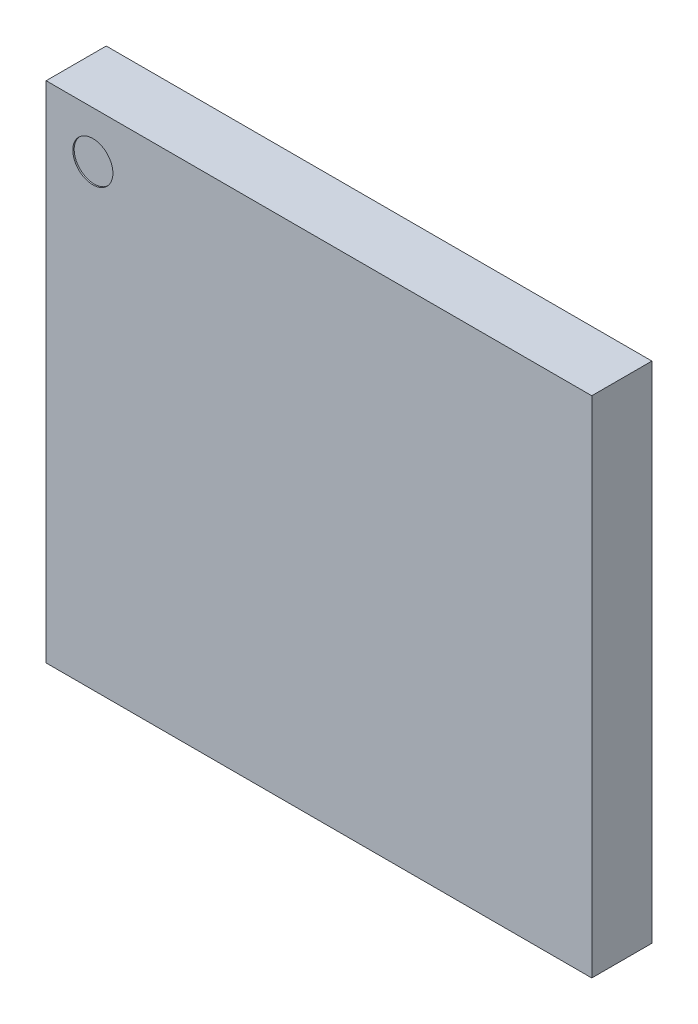
ISO-10303-21;
HEADER;
FILE_DESCRIPTION(('STEP AP214'),'2;1');
FILE_NAME('part.step','',(''),(''),'','','');
FILE_SCHEMA(('AUTOMOTIVE_DESIGN { 1 0 10303 214 1 1 1 1 }'));
ENDSEC;
DATA;
#1=APPLICATION_CONTEXT('core data for automotive mechanical design processes');
#2=APPLICATION_PROTOCOL_DEFINITION('international standard','automotive_design',2000,#1);
#3=PRODUCT_CONTEXT('',#1,'mechanical');
#4=PRODUCT('Part','Part','',(#3));
#5=PRODUCT_RELATED_PRODUCT_CATEGORY('part','',(#4));
#6=PRODUCT_DEFINITION_FORMATION('','',#4);
#7=PRODUCT_DEFINITION_CONTEXT('part definition',#1,'design');
#8=PRODUCT_DEFINITION('design','',#6,#7);
#9=PRODUCT_DEFINITION_SHAPE('','',#8);
#10=(LENGTH_UNIT() NAMED_UNIT(*) SI_UNIT(.MILLI.,.METRE.));
#11=(NAMED_UNIT(*) PLANE_ANGLE_UNIT() SI_UNIT($,.RADIAN.));
#12=(NAMED_UNIT(*) SI_UNIT($,.STERADIAN.) SOLID_ANGLE_UNIT());
#13=UNCERTAINTY_MEASURE_WITH_UNIT(LENGTH_MEASURE(1.E-05),#10,'distance_accuracy_value','');
#14=(GEOMETRIC_REPRESENTATION_CONTEXT(3) GLOBAL_UNCERTAINTY_ASSIGNED_CONTEXT((#13)) GLOBAL_UNIT_ASSIGNED_CONTEXT((#10,
#11,#12)) REPRESENTATION_CONTEXT('',''));
#15=CARTESIAN_POINT('',(0.,0.,0.));
#16=DIRECTION('',(0.,0.,1.));
#17=DIRECTION('',(1.,0.,0.));
#18=AXIS2_PLACEMENT_3D('',#15,#16,#17);
#19=CARTESIAN_POINT('',(0.,-1.88750000000007,0.582499999999956));
#20=DIRECTION('',(0.,0.,1.));
#21=DIRECTION('',(1.,0.,0.));
#22=AXIS2_PLACEMENT_3D('',#19,#20,#21);
#23=PLANE('',#22);
#24=CARTESIAN_POINT('',(-1.69250000000009,1.53749999999995,0.582499999999956));
#25=DIRECTION('',(0.,0.,1.));
#26=DIRECTION('',(1.,0.,0.));
#27=AXIS2_PLACEMENT_3D('',#24,#25,#26);
#28=CIRCLE('',#27,0.15000000000001);
#29=CARTESIAN_POINT('',(-1.54250000000008,1.53749999999995,0.582499999999956));
#30=VERTEX_POINT('',#29);
#31=EDGE_CURVE('E20',#30,#30,#28,.T.);
#32=ORIENTED_EDGE('',*,*,#31,.T.);
#33=EDGE_LOOP('',(#32));
#34=FACE_BOUND('',#33,.T.);
#35=ADVANCED_FACE('F17',(#34),#23,.T.);
#36=CARTESIAN_POINT('',(-1.69250000000009,1.53749999999995,0.592499999999916));
#37=DIRECTION('',(0.,0.,1.));
#38=DIRECTION('',(1.,0.,0.));
#39=AXIS2_PLACEMENT_3D('',#36,#37,#38);
#40=CYLINDRICAL_SURFACE('',#39,0.15000000000001);
#41=ORIENTED_EDGE('',*,*,#31,.F.);
#42=EDGE_LOOP('',(#41));
#43=FACE_BOUND('',#42,.T.);
#44=CARTESIAN_POINT('',(-1.69250000000009,1.53749999999995,0.592499999999916));
#45=DIRECTION('',(0.,0.,1.));
#46=DIRECTION('',(1.,0.,0.));
#47=AXIS2_PLACEMENT_3D('',#44,#45,#46);
#48=CIRCLE('',#47,0.15000000000001);
#49=CARTESIAN_POINT('',(-1.54250000000008,1.53749999999995,0.592499999999916));
#50=VERTEX_POINT('',#49);
#51=EDGE_CURVE('E69',#50,#50,#48,.F.);
#52=ORIENTED_EDGE('',*,*,#51,.F.);
#53=EDGE_LOOP('',(#52));
#54=FACE_BOUND('',#53,.T.);
#55=ADVANCED_FACE('F89',(#43,#54),#40,.F.);
#56=CARTESIAN_POINT('',(-2.04249999999996,-1.88750000000007,0.592499999999916));
#57=DIRECTION('',(0.,0.,1.));
#58=DIRECTION('',(1.,0.,0.));
#59=AXIS2_PLACEMENT_3D('',#56,#57,#58);
#60=PLANE('',#59);
#61=ORIENTED_EDGE('',*,*,#51,.T.);
#62=EDGE_LOOP('',(#61));
#63=FACE_BOUND('',#62,.T.);
#64=DIRECTION('',(0.,1.,0.));
#65=VECTOR('',#64,1.);
#66=CARTESIAN_POINT('',(-2.04249999999996,-1.88750000000007,0.592499999999916));
#67=LINE('',#66,#65);
#68=CARTESIAN_POINT('',(-2.04249999999996,-1.88750000000007,0.592499999999916));
#69=VERTEX_POINT('',#68);
#70=CARTESIAN_POINT('',(-2.04249999999996,1.88750000000007,0.592499999999916));
#71=VERTEX_POINT('',#70);
#72=EDGE_CURVE('E60',#69,#71,#67,.T.);
#73=ORIENTED_EDGE('',*,*,#72,.F.);
#74=DIRECTION('',(1.,0.,0.));
#75=VECTOR('',#74,1.);
#76=CARTESIAN_POINT('',(0.,-1.88750000000007,0.592499999999916));
#77=LINE('',#76,#75);
#78=CARTESIAN_POINT('',(2.04249999999996,-1.88750000000007,0.592499999999916));
#79=VERTEX_POINT('',#78);
#80=EDGE_CURVE('E197',#69,#79,#77,.T.);
#81=ORIENTED_EDGE('',*,*,#80,.T.);
#82=DIRECTION('',(0.,1.,0.));
#83=VECTOR('',#82,1.);
#84=CARTESIAN_POINT('',(2.04249999999996,-1.88750000000007,0.592499999999916));
#85=LINE('',#84,#83);
#86=CARTESIAN_POINT('',(2.04249999999996,1.88750000000007,0.592499999999916));
#87=VERTEX_POINT('',#86);
#88=EDGE_CURVE('E72',#87,#79,#85,.F.);
#89=ORIENTED_EDGE('',*,*,#88,.F.);
#90=DIRECTION('',(1.,0.,0.));
#91=VECTOR('',#90,1.);
#92=CARTESIAN_POINT('',(0.,1.88750000000007,0.592499999999916));
#93=LINE('',#92,#91);
#94=EDGE_CURVE('E55',#71,#87,#93,.T.);
#95=ORIENTED_EDGE('',*,*,#94,.F.);
#96=EDGE_LOOP('',(#73,#81,#89,#95));
#97=FACE_BOUND('',#96,.T.);
#98=ADVANCED_FACE('F71',(#63,#97),#60,.T.);
#99=CARTESIAN_POINT('',(-2.04249999999996,-1.88750000000007,0.142499999999989));
#100=DIRECTION('',(-1.,0.,0.));
#101=DIRECTION('',(0.,0.,1.));
#102=AXIS2_PLACEMENT_3D('',#99,#100,#101);
#103=PLANE('',#102);
#104=DIRECTION('',(0.,1.,0.));
#105=VECTOR('',#104,1.);
#106=CARTESIAN_POINT('',(-2.04249999999996,-1.88750000000007,0.142499999999989));
#107=LINE('',#106,#105);
#108=CARTESIAN_POINT('',(-2.04249999999996,-1.88750000000007,0.142499999999989));
#109=VERTEX_POINT('',#108);
#110=CARTESIAN_POINT('',(-2.04249999999996,1.88750000000007,0.142499999999989));
#111=VERTEX_POINT('',#110);
#112=EDGE_CURVE('E198',#109,#111,#107,.T.);
#113=ORIENTED_EDGE('',*,*,#112,.F.);
#114=DIRECTION('',(0.,0.,1.));
#115=VECTOR('',#114,1.);
#116=CARTESIAN_POINT('',(-2.04249999999996,-1.88750000000007,0.));
#117=LINE('',#116,#115);
#118=EDGE_CURVE('E65',#109,#69,#117,.T.);
#119=ORIENTED_EDGE('',*,*,#118,.T.);
#120=ORIENTED_EDGE('',*,*,#72,.T.);
#121=DIRECTION('',(0.,0.,1.));
#122=VECTOR('',#121,1.);
#123=CARTESIAN_POINT('',(-2.04249999999996,1.88750000000007,0.));
#124=LINE('',#123,#122);
#125=EDGE_CURVE('E62',#111,#71,#124,.T.);
#126=ORIENTED_EDGE('',*,*,#125,.F.);
#127=EDGE_LOOP('',(#113,#119,#120,#126));
#128=FACE_BOUND('',#127,.T.);
#129=ADVANCED_FACE('F61',(#128),#103,.T.);
#130=CARTESIAN_POINT('',(0.,1.88750000000007,0.));
#131=DIRECTION('',(0.,1.,0.));
#132=DIRECTION('',(0.,0.,1.));
#133=AXIS2_PLACEMENT_3D('',#130,#131,#132);
#134=PLANE('',#133);
#135=ORIENTED_EDGE('',*,*,#94,.T.);
#136=DIRECTION('',(0.,0.,-1.));
#137=VECTOR('',#136,1.);
#138=CARTESIAN_POINT('',(2.04249999999996,1.88750000000007,0.592499999999916));
#139=LINE('',#138,#137);
#140=CARTESIAN_POINT('',(2.04249999999996,1.88750000000007,0.142499999999989));
#141=VERTEX_POINT('',#140);
#142=EDGE_CURVE('E74',#141,#87,#139,.F.);
#143=ORIENTED_EDGE('',*,*,#142,.F.);
#144=DIRECTION('',(-1.,0.,0.));
#145=VECTOR('',#144,1.);
#146=CARTESIAN_POINT('',(2.04249999999996,1.88750000000007,0.142499999999989));
#147=LINE('',#146,#145);
#148=EDGE_CURVE('E78',#111,#141,#147,.F.);
#149=ORIENTED_EDGE('',*,*,#148,.F.);
#150=ORIENTED_EDGE('',*,*,#125,.T.);
#151=EDGE_LOOP('',(#135,#143,#149,#150));
#152=FACE_BOUND('',#151,.T.);
#153=ADVANCED_FACE('F76',(#152),#134,.T.);
#154=CARTESIAN_POINT('',(2.04249999999996,-1.88750000000007,0.592499999999916));
#155=DIRECTION('',(1.,0.,0.));
#156=DIRECTION('',(0.,0.,-1.));
#157=AXIS2_PLACEMENT_3D('',#154,#155,#156);
#158=PLANE('',#157);
#159=ORIENTED_EDGE('',*,*,#88,.T.);
#160=DIRECTION('',(0.,0.,1.));
#161=VECTOR('',#160,1.);
#162=CARTESIAN_POINT('',(2.04249999999996,-1.88750000000007,0.));
#163=LINE('',#162,#161);
#164=CARTESIAN_POINT('',(2.04249999999996,-1.88750000000007,0.142499999999989));
#165=VERTEX_POINT('',#164);
#166=EDGE_CURVE('E35',#79,#165,#163,.F.);
#167=ORIENTED_EDGE('',*,*,#166,.T.);
#168=DIRECTION('',(0.,1.,0.));
#169=VECTOR('',#168,1.);
#170=CARTESIAN_POINT('',(2.04249999999996,-1.88750000000007,0.142499999999989));
#171=LINE('',#170,#169);
#172=EDGE_CURVE('E26',#141,#165,#171,.F.);
#173=ORIENTED_EDGE('',*,*,#172,.F.);
#174=ORIENTED_EDGE('',*,*,#142,.T.);
#175=EDGE_LOOP('',(#159,#167,#173,#174));
#176=FACE_BOUND('',#175,.T.);
#177=ADVANCED_FACE('F106',(#176),#158,.T.);
#178=CARTESIAN_POINT('',(0.,-1.88750000000007,0.));
#179=DIRECTION('',(0.,1.,0.));
#180=DIRECTION('',(0.,0.,1.));
#181=AXIS2_PLACEMENT_3D('',#178,#179,#180);
#182=PLANE('',#181);
#183=ORIENTED_EDGE('',*,*,#118,.F.);
#184=DIRECTION('',(-1.,0.,0.));
#185=VECTOR('',#184,1.);
#186=CARTESIAN_POINT('',(2.04249999999996,-1.88750000000007,0.142499999999989));
#187=LINE('',#186,#185);
#188=EDGE_CURVE('E11',#165,#109,#187,.T.);
#189=ORIENTED_EDGE('',*,*,#188,.F.);
#190=ORIENTED_EDGE('',*,*,#166,.F.);
#191=ORIENTED_EDGE('',*,*,#80,.F.);
#192=EDGE_LOOP('',(#183,#189,#190,#191));
#193=FACE_BOUND('',#192,.T.);
#194=ADVANCED_FACE('F100',(#193),#182,.F.);
#195=CARTESIAN_POINT('',(2.04249999999996,-1.88750000000007,0.142499999999989));
#196=DIRECTION('',(0.,0.,-1.));
#197=DIRECTION('',(-1.,0.,0.));
#198=AXIS2_PLACEMENT_3D('',#195,#196,#197);
#199=PLANE('',#198);
#200=ORIENTED_EDGE('',*,*,#172,.T.);
#201=ORIENTED_EDGE('',*,*,#188,.T.);
#202=ORIENTED_EDGE('',*,*,#112,.T.);
#203=ORIENTED_EDGE('',*,*,#148,.T.);
#204=EDGE_LOOP('',(#200,#201,#202,#203));
#205=FACE_BOUND('',#204,.T.);
#206=ADVANCED_FACE('F98',(#205),#199,.T.);
#207=CLOSED_SHELL('',(#35,#55,#98,#129,#153,#177,#194,#206));
#208=MANIFOLD_SOLID_BREP('B1',#207);
#209=ADVANCED_BREP_SHAPE_REPRESENTATION('',(#18,#208),#14);
#210=SHAPE_DEFINITION_REPRESENTATION(#9,#209);
ENDSEC;
END-ISO-10303-21;
